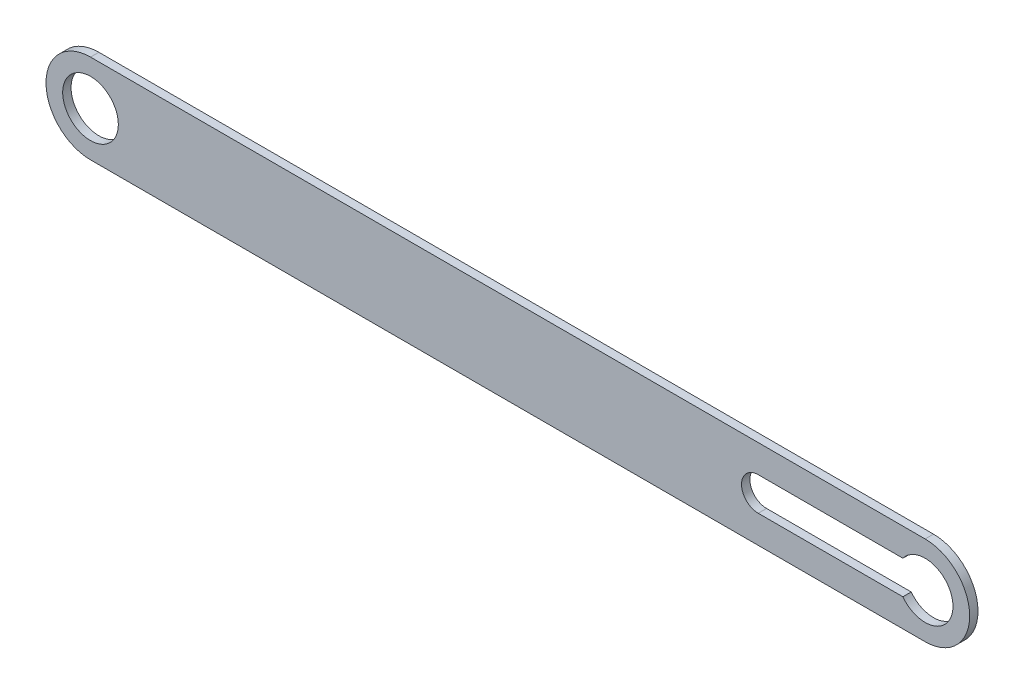
ISO-10303-21;
HEADER;
FILE_DESCRIPTION(('STEP AP214'),'2;1');
FILE_NAME('part.step','',(''),(''),'','','');
FILE_SCHEMA(('AUTOMOTIVE_DESIGN { 1 0 10303 214 1 1 1 1 }'));
ENDSEC;
DATA;
#1=APPLICATION_CONTEXT('core data for automotive mechanical design processes');
#2=APPLICATION_PROTOCOL_DEFINITION('international standard','automotive_design',2000,#1);
#3=PRODUCT_CONTEXT('',#1,'mechanical');
#4=PRODUCT('Part','Part','',(#3));
#5=PRODUCT_RELATED_PRODUCT_CATEGORY('part','',(#4));
#6=PRODUCT_DEFINITION_FORMATION('','',#4);
#7=PRODUCT_DEFINITION_CONTEXT('part definition',#1,'design');
#8=PRODUCT_DEFINITION('design','',#6,#7);
#9=PRODUCT_DEFINITION_SHAPE('','',#8);
#10=(LENGTH_UNIT() NAMED_UNIT(*) SI_UNIT(.MILLI.,.METRE.));
#11=(NAMED_UNIT(*) PLANE_ANGLE_UNIT() SI_UNIT($,.RADIAN.));
#12=(NAMED_UNIT(*) SI_UNIT($,.STERADIAN.) SOLID_ANGLE_UNIT());
#13=UNCERTAINTY_MEASURE_WITH_UNIT(LENGTH_MEASURE(1.E-05),#10,'distance_accuracy_value','');
#14=(GEOMETRIC_REPRESENTATION_CONTEXT(3) GLOBAL_UNCERTAINTY_ASSIGNED_CONTEXT((#13)) GLOBAL_UNIT_ASSIGNED_CONTEXT((#10,
#11,#12)) REPRESENTATION_CONTEXT('',''));
#15=CARTESIAN_POINT('',(0.,0.,0.));
#16=DIRECTION('',(0.,0.,1.));
#17=DIRECTION('',(1.,0.,0.));
#18=AXIS2_PLACEMENT_3D('',#15,#16,#17);
#19=CARTESIAN_POINT('',(-75.,0.,1.5));
#20=DIRECTION('',(0.,0.,1.));
#21=DIRECTION('',(1.,0.,0.));
#22=AXIS2_PLACEMENT_3D('',#19,#20,#21);
#23=PLANE('',#22);
#24=CARTESIAN_POINT('',(-75.,0.,1.5));
#25=DIRECTION('',(0.,0.,1.));
#26=DIRECTION('',(1.,0.,0.));
#27=AXIS2_PLACEMENT_3D('',#24,#25,#26);
#28=CIRCLE('',#27,8.00000000000001);
#29=CARTESIAN_POINT('',(-75.,8.00000000000001,1.5));
#30=VERTEX_POINT('',#29);
#31=CARTESIAN_POINT('',(-75.,-8.00000000000001,1.5));
#32=VERTEX_POINT('',#31);
#33=EDGE_CURVE('E165',#30,#32,#28,.T.);
#34=ORIENTED_EDGE('',*,*,#33,.T.);
#35=DIRECTION('',(1.,0.,0.));
#36=VECTOR('',#35,1.);
#37=CARTESIAN_POINT('',(-75.,-8.00000000000001,1.5));
#38=LINE('',#37,#36);
#39=CARTESIAN_POINT('',(75.,-8.00000000000001,1.5));
#40=VERTEX_POINT('',#39);
#41=EDGE_CURVE('E169',#32,#40,#38,.T.);
#42=ORIENTED_EDGE('',*,*,#41,.T.);
#43=CARTESIAN_POINT('',(75.,0.,1.5));
#44=DIRECTION('',(0.,0.,1.));
#45=DIRECTION('',(1.,0.,0.));
#46=AXIS2_PLACEMENT_3D('',#43,#44,#45);
#47=CIRCLE('',#46,8.00000000000001);
#48=CARTESIAN_POINT('',(75.,8.00000000000004,1.5));
#49=VERTEX_POINT('',#48);
#50=EDGE_CURVE('E173',#40,#49,#47,.T.);
#51=ORIENTED_EDGE('',*,*,#50,.T.);
#52=DIRECTION('',(-1.,0.,0.));
#53=VECTOR('',#52,1.);
#54=CARTESIAN_POINT('',(-75.,8.00000000000001,1.5));
#55=LINE('',#54,#53);
#56=EDGE_CURVE('E176',#49,#30,#55,.T.);
#57=ORIENTED_EDGE('',*,*,#56,.T.);
#58=EDGE_LOOP('',(#34,#42,#51,#57));
#59=FACE_BOUND('',#58,.T.);
#60=CARTESIAN_POINT('',(-75.,0.,1.5));
#61=DIRECTION('',(0.,0.,1.));
#62=DIRECTION('',(1.,0.,0.));
#63=AXIS2_PLACEMENT_3D('',#60,#61,#62);
#64=CIRCLE('',#63,5.);
#65=CARTESIAN_POINT('',(-70.,0.,1.5));
#66=VERTEX_POINT('',#65);
#67=EDGE_CURVE('E157',#66,#66,#64,.T.);
#68=ORIENTED_EDGE('',*,*,#67,.F.);
#69=EDGE_LOOP('',(#68));
#70=FACE_BOUND('',#69,.T.);
#71=DIRECTION('',(1.,0.,0.));
#72=VECTOR('',#71,1.);
#73=CARTESIAN_POINT('',(71.,-3.,1.5));
#74=LINE('',#73,#72);
#75=CARTESIAN_POINT('',(45.,-3.,1.5));
#76=VERTEX_POINT('',#75);
#77=CARTESIAN_POINT('',(71.,-3.,1.5));
#78=VERTEX_POINT('',#77);
#79=EDGE_CURVE('E118',#76,#78,#74,.T.);
#80=ORIENTED_EDGE('',*,*,#79,.F.);
#81=CARTESIAN_POINT('',(45.,0.,1.5));
#82=DIRECTION('',(0.,0.,1.));
#83=DIRECTION('',(1.,0.,0.));
#84=AXIS2_PLACEMENT_3D('',#81,#82,#83);
#85=CIRCLE('',#84,3.);
#86=CARTESIAN_POINT('',(45.,3.,1.5));
#87=VERTEX_POINT('',#86);
#88=EDGE_CURVE('E109',#87,#76,#85,.T.);
#89=ORIENTED_EDGE('',*,*,#88,.F.);
#90=DIRECTION('',(-1.,0.,0.));
#91=VECTOR('',#90,1.);
#92=CARTESIAN_POINT('',(71.,3.,1.5));
#93=LINE('',#92,#91);
#94=CARTESIAN_POINT('',(71.,3.,1.5));
#95=VERTEX_POINT('',#94);
#96=EDGE_CURVE('E135',#95,#87,#93,.T.);
#97=ORIENTED_EDGE('',*,*,#96,.F.);
#98=CARTESIAN_POINT('',(75.,0.,1.5));
#99=DIRECTION('',(0.,0.,1.));
#100=DIRECTION('',(1.,0.,0.));
#101=AXIS2_PLACEMENT_3D('',#98,#99,#100);
#102=CIRCLE('',#101,5.);
#103=EDGE_CURVE('E131',#78,#95,#102,.T.);
#104=ORIENTED_EDGE('',*,*,#103,.F.);
#105=EDGE_LOOP('',(#80,#89,#97,#104));
#106=FACE_BOUND('',#105,.T.);
#107=ADVANCED_FACE('F43',(#59,#70,#106),#23,.T.);
#108=CARTESIAN_POINT('',(-75.,0.,0.));
#109=DIRECTION('',(0.,0.,1.));
#110=DIRECTION('',(1.,0.,0.));
#111=AXIS2_PLACEMENT_3D('',#108,#109,#110);
#112=PLANE('',#111);
#113=CARTESIAN_POINT('',(-75.,0.,0.));
#114=DIRECTION('',(0.,0.,1.));
#115=DIRECTION('',(1.,0.,0.));
#116=AXIS2_PLACEMENT_3D('',#113,#114,#115);
#117=CIRCLE('',#116,5.);
#118=CARTESIAN_POINT('',(-70.,0.,0.));
#119=VERTEX_POINT('',#118);
#120=EDGE_CURVE('E127',#119,#119,#117,.T.);
#121=ORIENTED_EDGE('',*,*,#120,.T.);
#122=EDGE_LOOP('',(#121));
#123=FACE_BOUND('',#122,.T.);
#124=CARTESIAN_POINT('',(-75.,0.,0.));
#125=DIRECTION('',(0.,0.,1.));
#126=DIRECTION('',(1.,0.,0.));
#127=AXIS2_PLACEMENT_3D('',#124,#125,#126);
#128=CIRCLE('',#127,8.00000000000001);
#129=CARTESIAN_POINT('',(-75.,8.00000000000001,0.));
#130=VERTEX_POINT('',#129);
#131=CARTESIAN_POINT('',(-75.,-8.00000000000001,0.));
#132=VERTEX_POINT('',#131);
#133=EDGE_CURVE('E161',#130,#132,#128,.T.);
#134=ORIENTED_EDGE('',*,*,#133,.F.);
#135=DIRECTION('',(-1.,0.,0.));
#136=VECTOR('',#135,1.);
#137=CARTESIAN_POINT('',(-75.,8.00000000000001,0.));
#138=LINE('',#137,#136);
#139=CARTESIAN_POINT('',(75.,8.00000000000004,0.));
#140=VERTEX_POINT('',#139);
#141=EDGE_CURVE('E170',#140,#130,#138,.T.);
#142=ORIENTED_EDGE('',*,*,#141,.F.);
#143=CARTESIAN_POINT('',(75.,0.,0.));
#144=DIRECTION('',(0.,0.,1.));
#145=DIRECTION('',(1.,0.,0.));
#146=AXIS2_PLACEMENT_3D('',#143,#144,#145);
#147=CIRCLE('',#146,8.00000000000001);
#148=CARTESIAN_POINT('',(75.,-8.00000000000001,0.));
#149=VERTEX_POINT('',#148);
#150=EDGE_CURVE('E186',#149,#140,#147,.T.);
#151=ORIENTED_EDGE('',*,*,#150,.F.);
#152=DIRECTION('',(1.,0.,0.));
#153=VECTOR('',#152,1.);
#154=CARTESIAN_POINT('',(-75.,-8.00000000000001,0.));
#155=LINE('',#154,#153);
#156=EDGE_CURVE('E183',#132,#149,#155,.T.);
#157=ORIENTED_EDGE('',*,*,#156,.F.);
#158=EDGE_LOOP('',(#134,#142,#151,#157));
#159=FACE_BOUND('',#158,.T.);
#160=CARTESIAN_POINT('',(45.,0.,0.));
#161=DIRECTION('',(0.,0.,1.));
#162=DIRECTION('',(1.,0.,0.));
#163=AXIS2_PLACEMENT_3D('',#160,#161,#162);
#164=CIRCLE('',#163,3.);
#165=CARTESIAN_POINT('',(45.,3.,0.));
#166=VERTEX_POINT('',#165);
#167=CARTESIAN_POINT('',(45.,-3.,0.));
#168=VERTEX_POINT('',#167);
#169=EDGE_CURVE('E67',#166,#168,#164,.T.);
#170=ORIENTED_EDGE('',*,*,#169,.T.);
#171=DIRECTION('',(1.,0.,0.));
#172=VECTOR('',#171,1.);
#173=CARTESIAN_POINT('',(71.,-3.,0.));
#174=LINE('',#173,#172);
#175=CARTESIAN_POINT('',(71.,-3.,0.));
#176=VERTEX_POINT('',#175);
#177=EDGE_CURVE('E125',#168,#176,#174,.T.);
#178=ORIENTED_EDGE('',*,*,#177,.T.);
#179=CARTESIAN_POINT('',(75.,0.,0.));
#180=DIRECTION('',(0.,0.,1.));
#181=DIRECTION('',(1.,0.,0.));
#182=AXIS2_PLACEMENT_3D('',#179,#180,#181);
#183=CIRCLE('',#182,5.);
#184=CARTESIAN_POINT('',(71.,3.,0.));
#185=VERTEX_POINT('',#184);
#186=EDGE_CURVE('E144',#176,#185,#183,.T.);
#187=ORIENTED_EDGE('',*,*,#186,.T.);
#188=DIRECTION('',(-1.,0.,0.));
#189=VECTOR('',#188,1.);
#190=CARTESIAN_POINT('',(71.,3.,0.));
#191=LINE('',#190,#189);
#192=EDGE_CURVE('E119',#185,#166,#191,.T.);
#193=ORIENTED_EDGE('',*,*,#192,.T.);
#194=EDGE_LOOP('',(#170,#178,#187,#193));
#195=FACE_BOUND('',#194,.T.);
#196=ADVANCED_FACE('F209',(#123,#159,#195),#112,.F.);
#197=CARTESIAN_POINT('',(-75.,0.,1.5));
#198=DIRECTION('',(0.,0.,-1.));
#199=DIRECTION('',(-1.,0.,0.));
#200=AXIS2_PLACEMENT_3D('',#197,#198,#199);
#201=CYLINDRICAL_SURFACE('',#200,8.00000000000001);
#202=ORIENTED_EDGE('',*,*,#133,.T.);
#203=DIRECTION('',(0.,0.,-1.));
#204=VECTOR('',#203,1.);
#205=CARTESIAN_POINT('',(-75.,-8.00000000000001,1.5));
#206=LINE('',#205,#204);
#207=EDGE_CURVE('E11',#32,#132,#206,.T.);
#208=ORIENTED_EDGE('',*,*,#207,.F.);
#209=ORIENTED_EDGE('',*,*,#33,.F.);
#210=DIRECTION('',(0.,0.,-1.));
#211=VECTOR('',#210,1.);
#212=CARTESIAN_POINT('',(-75.,8.00000000000001,1.5));
#213=LINE('',#212,#211);
#214=EDGE_CURVE('E179',#30,#130,#213,.T.);
#215=ORIENTED_EDGE('',*,*,#214,.T.);
#216=EDGE_LOOP('',(#202,#208,#209,#215));
#217=FACE_BOUND('',#216,.T.);
#218=ADVANCED_FACE('F45',(#217),#201,.T.);
#219=CARTESIAN_POINT('',(-75.,-8.00000000000001,1.5));
#220=DIRECTION('',(0.,1.,0.));
#221=DIRECTION('',(-1.,0.,0.));
#222=AXIS2_PLACEMENT_3D('',#219,#220,#221);
#223=PLANE('',#222);
#224=ORIENTED_EDGE('',*,*,#156,.T.);
#225=DIRECTION('',(0.,0.,-1.));
#226=VECTOR('',#225,1.);
#227=CARTESIAN_POINT('',(75.,-8.00000000000001,1.5));
#228=LINE('',#227,#226);
#229=EDGE_CURVE('E52',#40,#149,#228,.T.);
#230=ORIENTED_EDGE('',*,*,#229,.F.);
#231=ORIENTED_EDGE('',*,*,#41,.F.);
#232=ORIENTED_EDGE('',*,*,#207,.T.);
#233=EDGE_LOOP('',(#224,#230,#231,#232));
#234=FACE_BOUND('',#233,.T.);
#235=ADVANCED_FACE('F220',(#234),#223,.F.);
#236=CARTESIAN_POINT('',(75.,0.,1.5));
#237=DIRECTION('',(0.,0.,-1.));
#238=DIRECTION('',(-1.,0.,0.));
#239=AXIS2_PLACEMENT_3D('',#236,#237,#238);
#240=CYLINDRICAL_SURFACE('',#239,8.00000000000001);
#241=ORIENTED_EDGE('',*,*,#150,.T.);
#242=DIRECTION('',(0.,0.,-1.));
#243=VECTOR('',#242,1.);
#244=CARTESIAN_POINT('',(75.,8.00000000000004,1.5));
#245=LINE('',#244,#243);
#246=EDGE_CURVE('E194',#49,#140,#245,.T.);
#247=ORIENTED_EDGE('',*,*,#246,.F.);
#248=ORIENTED_EDGE('',*,*,#50,.F.);
#249=ORIENTED_EDGE('',*,*,#229,.T.);
#250=EDGE_LOOP('',(#241,#247,#248,#249));
#251=FACE_BOUND('',#250,.T.);
#252=ADVANCED_FACE('F203',(#251),#240,.T.);
#253=CARTESIAN_POINT('',(-75.,8.00000000000001,1.5));
#254=DIRECTION('',(0.,-1.,0.));
#255=DIRECTION('',(1.,0.,0.));
#256=AXIS2_PLACEMENT_3D('',#253,#254,#255);
#257=PLANE('',#256);
#258=ORIENTED_EDGE('',*,*,#141,.T.);
#259=ORIENTED_EDGE('',*,*,#214,.F.);
#260=ORIENTED_EDGE('',*,*,#56,.F.);
#261=ORIENTED_EDGE('',*,*,#246,.T.);
#262=EDGE_LOOP('',(#258,#259,#260,#261));
#263=FACE_BOUND('',#262,.T.);
#264=ADVANCED_FACE('F213',(#263),#257,.F.);
#265=CARTESIAN_POINT('',(-75.,0.,1.5));
#266=DIRECTION('',(0.,0.,-1.));
#267=DIRECTION('',(-1.,0.,0.));
#268=AXIS2_PLACEMENT_3D('',#265,#266,#267);
#269=CYLINDRICAL_SURFACE('',#268,5.);
#270=ORIENTED_EDGE('',*,*,#67,.T.);
#271=EDGE_LOOP('',(#270));
#272=FACE_BOUND('',#271,.T.);
#273=ORIENTED_EDGE('',*,*,#120,.F.);
#274=EDGE_LOOP('',(#273));
#275=FACE_BOUND('',#274,.T.);
#276=ADVANCED_FACE('F235',(#272,#275),#269,.F.);
#277=CARTESIAN_POINT('',(45.,0.,1.5));
#278=DIRECTION('',(0.,0.,-1.));
#279=DIRECTION('',(-1.,0.,0.));
#280=AXIS2_PLACEMENT_3D('',#277,#278,#279);
#281=CYLINDRICAL_SURFACE('',#280,3.);
#282=ORIENTED_EDGE('',*,*,#169,.F.);
#283=DIRECTION('',(0.,0.,-1.));
#284=VECTOR('',#283,1.);
#285=CARTESIAN_POINT('',(45.,3.,1.5));
#286=LINE('',#285,#284);
#287=EDGE_CURVE('E113',#87,#166,#286,.T.);
#288=ORIENTED_EDGE('',*,*,#287,.F.);
#289=ORIENTED_EDGE('',*,*,#88,.T.);
#290=DIRECTION('',(0.,0.,-1.));
#291=VECTOR('',#290,1.);
#292=CARTESIAN_POINT('',(45.,-3.,1.5));
#293=LINE('',#292,#291);
#294=EDGE_CURVE('E112',#76,#168,#293,.T.);
#295=ORIENTED_EDGE('',*,*,#294,.T.);
#296=EDGE_LOOP('',(#282,#288,#289,#295));
#297=FACE_BOUND('',#296,.T.);
#298=ADVANCED_FACE('F111',(#297),#281,.F.);
#299=CARTESIAN_POINT('',(71.,-3.,1.5));
#300=DIRECTION('',(0.,1.,0.));
#301=DIRECTION('',(-1.,0.,0.));
#302=AXIS2_PLACEMENT_3D('',#299,#300,#301);
#303=PLANE('',#302);
#304=ORIENTED_EDGE('',*,*,#177,.F.);
#305=ORIENTED_EDGE('',*,*,#294,.F.);
#306=ORIENTED_EDGE('',*,*,#79,.T.);
#307=DIRECTION('',(0.,0.,-1.));
#308=VECTOR('',#307,1.);
#309=CARTESIAN_POINT('',(71.,-3.,1.5));
#310=LINE('',#309,#308);
#311=EDGE_CURVE('E128',#78,#176,#310,.T.);
#312=ORIENTED_EDGE('',*,*,#311,.T.);
#313=EDGE_LOOP('',(#304,#305,#306,#312));
#314=FACE_BOUND('',#313,.T.);
#315=ADVANCED_FACE('F122',(#314),#303,.T.);
#316=CARTESIAN_POINT('',(75.,0.,1.5));
#317=DIRECTION('',(0.,0.,-1.));
#318=DIRECTION('',(-1.,0.,0.));
#319=AXIS2_PLACEMENT_3D('',#316,#317,#318);
#320=CYLINDRICAL_SURFACE('',#319,5.);
#321=ORIENTED_EDGE('',*,*,#186,.F.);
#322=ORIENTED_EDGE('',*,*,#311,.F.);
#323=ORIENTED_EDGE('',*,*,#103,.T.);
#324=DIRECTION('',(0.,0.,-1.));
#325=VECTOR('',#324,1.);
#326=CARTESIAN_POINT('',(71.,3.,1.5));
#327=LINE('',#326,#325);
#328=EDGE_CURVE('E59',#95,#185,#327,.T.);
#329=ORIENTED_EDGE('',*,*,#328,.T.);
#330=EDGE_LOOP('',(#321,#322,#323,#329));
#331=FACE_BOUND('',#330,.T.);
#332=ADVANCED_FACE('F252',(#331),#320,.F.);
#333=CARTESIAN_POINT('',(71.,3.,1.5));
#334=DIRECTION('',(0.,-1.,0.));
#335=DIRECTION('',(1.,0.,0.));
#336=AXIS2_PLACEMENT_3D('',#333,#334,#335);
#337=PLANE('',#336);
#338=ORIENTED_EDGE('',*,*,#192,.F.);
#339=ORIENTED_EDGE('',*,*,#328,.F.);
#340=ORIENTED_EDGE('',*,*,#96,.T.);
#341=ORIENTED_EDGE('',*,*,#287,.T.);
#342=EDGE_LOOP('',(#338,#339,#340,#341));
#343=FACE_BOUND('',#342,.T.);
#344=ADVANCED_FACE('F257',(#343),#337,.T.);
#345=CLOSED_SHELL('',(#107,#196,#218,#235,#252,#264,#276,#298,#315,#332,#344));
#346=MANIFOLD_SOLID_BREP('B2',#345);
#347=ADVANCED_BREP_SHAPE_REPRESENTATION('',(#18,#346),#14);
#348=SHAPE_DEFINITION_REPRESENTATION(#9,#347);
ENDSEC;
END-ISO-10303-21;
